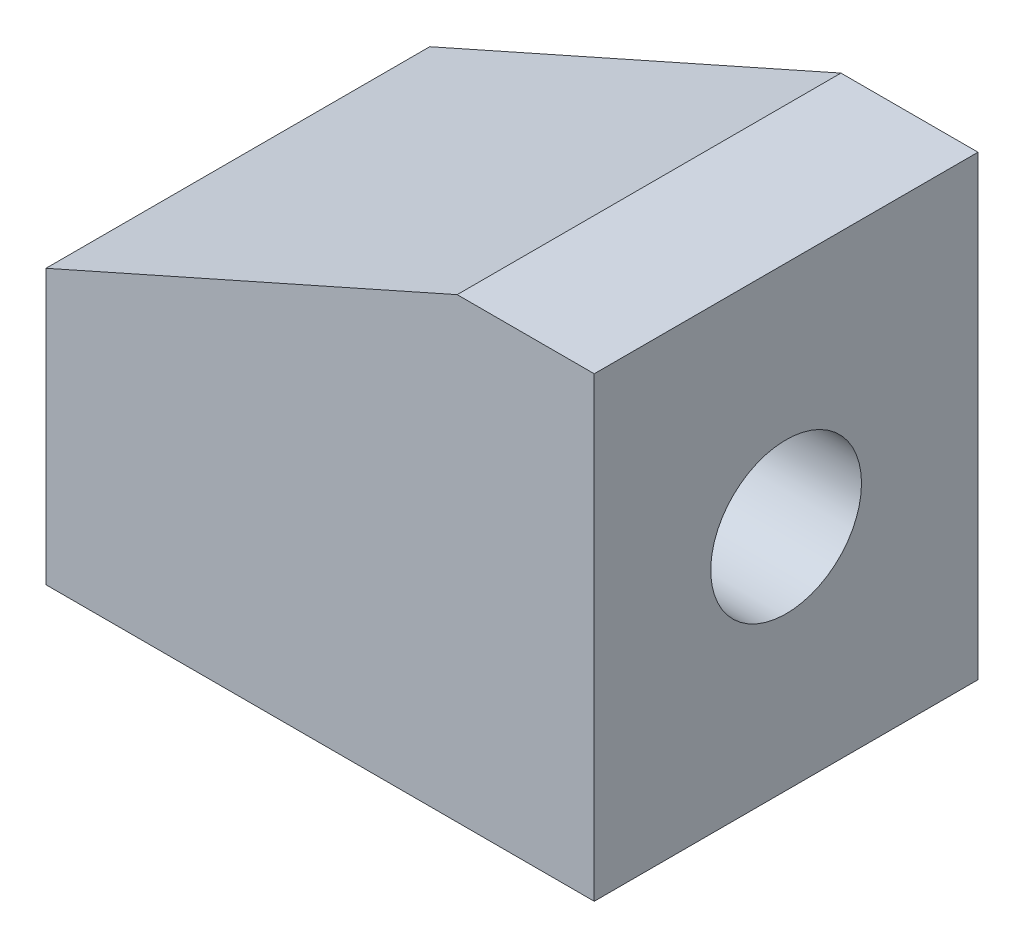
ISO-10303-21;
HEADER;
FILE_DESCRIPTION(('STEP AP214'),'2;1');
FILE_NAME('part.step','',(''),(''),'','','');
FILE_SCHEMA(('AUTOMOTIVE_DESIGN { 1 0 10303 214 1 1 1 1 }'));
ENDSEC;
DATA;
#1=APPLICATION_CONTEXT('core data for automotive mechanical design processes');
#2=APPLICATION_PROTOCOL_DEFINITION('international standard','automotive_design',2000,#1);
#3=PRODUCT_CONTEXT('',#1,'mechanical');
#4=PRODUCT('Part','Part','',(#3));
#5=PRODUCT_RELATED_PRODUCT_CATEGORY('part','',(#4));
#6=PRODUCT_DEFINITION_FORMATION('','',#4);
#7=PRODUCT_DEFINITION_CONTEXT('part definition',#1,'design');
#8=PRODUCT_DEFINITION('design','',#6,#7);
#9=PRODUCT_DEFINITION_SHAPE('','',#8);
#10=(LENGTH_UNIT() NAMED_UNIT(*) SI_UNIT(.MILLI.,.METRE.));
#11=(NAMED_UNIT(*) PLANE_ANGLE_UNIT() SI_UNIT($,.RADIAN.));
#12=(NAMED_UNIT(*) SI_UNIT($,.STERADIAN.) SOLID_ANGLE_UNIT());
#13=UNCERTAINTY_MEASURE_WITH_UNIT(LENGTH_MEASURE(1.E-05),#10,'distance_accuracy_value','');
#14=(GEOMETRIC_REPRESENTATION_CONTEXT(3) GLOBAL_UNCERTAINTY_ASSIGNED_CONTEXT((#13)) GLOBAL_UNIT_ASSIGNED_CONTEXT((#10,
#11,#12)) REPRESENTATION_CONTEXT('',''));
#15=CARTESIAN_POINT('',(0.,0.,0.));
#16=DIRECTION('',(0.,0.,1.));
#17=DIRECTION('',(1.,0.,0.));
#18=AXIS2_PLACEMENT_3D('',#15,#16,#17);
#19=CARTESIAN_POINT('',(-60.,30.,42.));
#20=DIRECTION('',(1.,0.,0.));
#21=DIRECTION('',(0.,0.,-1.));
#22=AXIS2_PLACEMENT_3D('',#19,#20,#21);
#23=PLANE('',#22);
#24=DIRECTION('',(0.,-1.,0.));
#25=VECTOR('',#24,1.);
#26=CARTESIAN_POINT('',(-60.,30.,0.));
#27=LINE('',#26,#25);
#28=CARTESIAN_POINT('',(-60.,30.,0.));
#29=VERTEX_POINT('',#28);
#30=CARTESIAN_POINT('',(-60.,0.,0.));
#31=VERTEX_POINT('',#30);
#32=EDGE_CURVE('E126',#29,#31,#27,.T.);
#33=ORIENTED_EDGE('',*,*,#32,.T.);
#34=DIRECTION('',(0.,0.,-1.));
#35=VECTOR('',#34,1.);
#36=CARTESIAN_POINT('',(-60.,0.,42.));
#37=LINE('',#36,#35);
#38=CARTESIAN_POINT('',(-60.,0.,42.));
#39=VERTEX_POINT('',#38);
#40=EDGE_CURVE('E11',#39,#31,#37,.T.);
#41=ORIENTED_EDGE('',*,*,#40,.F.);
#42=DIRECTION('',(0.,-1.,0.));
#43=VECTOR('',#42,1.);
#44=CARTESIAN_POINT('',(-60.,30.,42.));
#45=LINE('',#44,#43);
#46=CARTESIAN_POINT('',(-60.,30.,42.));
#47=VERTEX_POINT('',#46);
#48=EDGE_CURVE('E140',#47,#39,#45,.T.);
#49=ORIENTED_EDGE('',*,*,#48,.F.);
#50=DIRECTION('',(0.,0.,-1.));
#51=VECTOR('',#50,1.);
#52=CARTESIAN_POINT('',(-60.,30.,42.));
#53=LINE('',#52,#51);
#54=EDGE_CURVE('E122',#47,#29,#53,.T.);
#55=ORIENTED_EDGE('',*,*,#54,.T.);
#56=EDGE_LOOP('',(#33,#41,#49,#55));
#57=FACE_BOUND('',#56,.T.);
#58=ADVANCED_FACE('F45',(#57),#23,.F.);
#59=CARTESIAN_POINT('',(-60.,0.,42.));
#60=DIRECTION('',(0.,1.,0.));
#61=DIRECTION('',(0.,0.,1.));
#62=AXIS2_PLACEMENT_3D('',#59,#60,#61);
#63=PLANE('',#62);
#64=DIRECTION('',(1.,0.,0.));
#65=VECTOR('',#64,1.);
#66=CARTESIAN_POINT('',(-60.,0.,0.));
#67=LINE('',#66,#65);
#68=CARTESIAN_POINT('',(0.,0.,0.));
#69=VERTEX_POINT('',#68);
#70=EDGE_CURVE('E130',#31,#69,#67,.T.);
#71=ORIENTED_EDGE('',*,*,#70,.T.);
#72=DIRECTION('',(0.,0.,-1.));
#73=VECTOR('',#72,1.);
#74=CARTESIAN_POINT('',(0.,0.,42.));
#75=LINE('',#74,#73);
#76=CARTESIAN_POINT('',(0.,0.,42.));
#77=VERTEX_POINT('',#76);
#78=EDGE_CURVE('E54',#77,#69,#75,.T.);
#79=ORIENTED_EDGE('',*,*,#78,.F.);
#80=DIRECTION('',(1.,0.,0.));
#81=VECTOR('',#80,1.);
#82=CARTESIAN_POINT('',(-60.,0.,42.));
#83=LINE('',#82,#81);
#84=EDGE_CURVE('E97',#39,#77,#83,.T.);
#85=ORIENTED_EDGE('',*,*,#84,.F.);
#86=ORIENTED_EDGE('',*,*,#40,.T.);
#87=EDGE_LOOP('',(#71,#79,#85,#86));
#88=FACE_BOUND('',#87,.T.);
#89=ADVANCED_FACE('F162',(#88),#63,.F.);
#90=CARTESIAN_POINT('',(0.,0.,42.));
#91=DIRECTION('',(-1.,0.,0.));
#92=DIRECTION('',(0.,0.,1.));
#93=AXIS2_PLACEMENT_3D('',#90,#91,#92);
#94=PLANE('',#93);
#95=CARTESIAN_POINT('',(0.,25.,21.));
#96=DIRECTION('',(1.,0.,0.));
#97=DIRECTION('',(0.,0.,-1.));
#98=AXIS2_PLACEMENT_3D('',#95,#96,#97);
#99=CIRCLE('',#98,8.24999999999999);
#100=CARTESIAN_POINT('',(0.,25.,12.75));
#101=VERTEX_POINT('',#100);
#102=EDGE_CURVE('E175',#101,#101,#99,.T.);
#103=ORIENTED_EDGE('',*,*,#102,.F.);
#104=EDGE_LOOP('',(#103));
#105=FACE_BOUND('',#104,.T.);
#106=DIRECTION('',(0.,1.,0.));
#107=VECTOR('',#106,1.);
#108=CARTESIAN_POINT('',(0.,0.,0.));
#109=LINE('',#108,#107);
#110=CARTESIAN_POINT('',(0.,50.,0.));
#111=VERTEX_POINT('',#110);
#112=EDGE_CURVE('E114',#69,#111,#109,.T.);
#113=ORIENTED_EDGE('',*,*,#112,.T.);
#114=DIRECTION('',(0.,0.,-1.));
#115=VECTOR('',#114,1.);
#116=CARTESIAN_POINT('',(0.,50.,42.));
#117=LINE('',#116,#115);
#118=CARTESIAN_POINT('',(0.,50.,42.));
#119=VERTEX_POINT('',#118);
#120=EDGE_CURVE('E111',#119,#111,#117,.T.);
#121=ORIENTED_EDGE('',*,*,#120,.F.);
#122=DIRECTION('',(0.,1.,0.));
#123=VECTOR('',#122,1.);
#124=CARTESIAN_POINT('',(0.,0.,42.));
#125=LINE('',#124,#123);
#126=EDGE_CURVE('E102',#77,#119,#125,.T.);
#127=ORIENTED_EDGE('',*,*,#126,.F.);
#128=ORIENTED_EDGE('',*,*,#78,.T.);
#129=EDGE_LOOP('',(#113,#121,#127,#128));
#130=FACE_BOUND('',#129,.T.);
#131=ADVANCED_FACE('F112',(#105,#130),#94,.F.);
#132=CARTESIAN_POINT('',(0.,50.,42.));
#133=DIRECTION('',(0.,-1.,0.));
#134=DIRECTION('',(1.,0.,0.));
#135=AXIS2_PLACEMENT_3D('',#132,#133,#134);
#136=PLANE('',#135);
#137=DIRECTION('',(-1.,0.,0.));
#138=VECTOR('',#137,1.);
#139=CARTESIAN_POINT('',(0.,50.,0.));
#140=LINE('',#139,#138);
#141=CARTESIAN_POINT('',(-15.,50.,0.));
#142=VERTEX_POINT('',#141);
#143=EDGE_CURVE('E83',#111,#142,#140,.T.);
#144=ORIENTED_EDGE('',*,*,#143,.T.);
#145=DIRECTION('',(0.,0.,-1.));
#146=VECTOR('',#145,1.);
#147=CARTESIAN_POINT('',(-15.,50.,42.));
#148=LINE('',#147,#146);
#149=CARTESIAN_POINT('',(-15.,50.,42.));
#150=VERTEX_POINT('',#149);
#151=EDGE_CURVE('E116',#150,#142,#148,.T.);
#152=ORIENTED_EDGE('',*,*,#151,.F.);
#153=DIRECTION('',(-1.,0.,0.));
#154=VECTOR('',#153,1.);
#155=CARTESIAN_POINT('',(0.,50.,42.));
#156=LINE('',#155,#154);
#157=EDGE_CURVE('E106',#119,#150,#156,.T.);
#158=ORIENTED_EDGE('',*,*,#157,.F.);
#159=ORIENTED_EDGE('',*,*,#120,.T.);
#160=EDGE_LOOP('',(#144,#152,#158,#159));
#161=FACE_BOUND('',#160,.T.);
#162=ADVANCED_FACE('F118',(#161),#136,.F.);
#163=CARTESIAN_POINT('',(-15.,50.,42.));
#164=DIRECTION('',(0.406138466053447,-0.913811548620257,0.));
#165=DIRECTION('',(0.913811548620257,0.406138466053448,0.));
#166=AXIS2_PLACEMENT_3D('',#163,#164,#165);
#167=PLANE('',#166);
#168=DIRECTION('',(-0.913811548620257,-0.406138466053448,0.));
#169=VECTOR('',#168,1.);
#170=CARTESIAN_POINT('',(-15.,50.,0.));
#171=LINE('',#170,#169);
#172=EDGE_CURVE('E89',#142,#29,#171,.T.);
#173=ORIENTED_EDGE('',*,*,#172,.T.);
#174=ORIENTED_EDGE('',*,*,#54,.F.);
#175=DIRECTION('',(-0.913811548620257,-0.406138466053448,0.));
#176=VECTOR('',#175,1.);
#177=CARTESIAN_POINT('',(-15.,50.,42.));
#178=LINE('',#177,#176);
#179=EDGE_CURVE('E62',#150,#47,#178,.T.);
#180=ORIENTED_EDGE('',*,*,#179,.F.);
#181=ORIENTED_EDGE('',*,*,#151,.T.);
#182=EDGE_LOOP('',(#173,#174,#180,#181));
#183=FACE_BOUND('',#182,.T.);
#184=ADVANCED_FACE('F151',(#183),#167,.F.);
#185=CARTESIAN_POINT('',(0.,0.,42.));
#186=DIRECTION('',(0.,0.,1.));
#187=DIRECTION('',(1.,0.,0.));
#188=AXIS2_PLACEMENT_3D('',#185,#186,#187);
#189=PLANE('',#188);
#190=ORIENTED_EDGE('',*,*,#48,.T.);
#191=ORIENTED_EDGE('',*,*,#84,.T.);
#192=ORIENTED_EDGE('',*,*,#126,.T.);
#193=ORIENTED_EDGE('',*,*,#157,.T.);
#194=ORIENTED_EDGE('',*,*,#179,.T.);
#195=EDGE_LOOP('',(#190,#191,#192,#193,#194));
#196=FACE_BOUND('',#195,.T.);
#197=ADVANCED_FACE('F104',(#196),#189,.T.);
#198=CARTESIAN_POINT('',(0.,0.,0.));
#199=DIRECTION('',(0.,0.,1.));
#200=DIRECTION('',(1.,0.,0.));
#201=AXIS2_PLACEMENT_3D('',#198,#199,#200);
#202=PLANE('',#201);
#203=ORIENTED_EDGE('',*,*,#32,.F.);
#204=ORIENTED_EDGE('',*,*,#172,.F.);
#205=ORIENTED_EDGE('',*,*,#143,.F.);
#206=ORIENTED_EDGE('',*,*,#112,.F.);
#207=ORIENTED_EDGE('',*,*,#70,.F.);
#208=EDGE_LOOP('',(#203,#204,#205,#206,#207));
#209=FACE_BOUND('',#208,.T.);
#210=ADVANCED_FACE('F147',(#209),#202,.F.);
#211=CARTESIAN_POINT('',(-43.5,25.,21.));
#212=DIRECTION('',(1.,0.,0.));
#213=DIRECTION('',(0.,0.,-1.));
#214=AXIS2_PLACEMENT_3D('',#211,#212,#213);
#215=CONICAL_SURFACE('',#214,8.24999999999999,1.02974425867665);
#216=CARTESIAN_POINT('',(-48.4571001069774,25.,21.));
#217=VERTEX_POINT('',#216);
#218=VERTEX_LOOP('',#217);
#219=FACE_BOUND('',#218,.T.);
#220=CARTESIAN_POINT('',(-43.5,25.,21.));
#221=DIRECTION('',(1.,0.,0.));
#222=DIRECTION('',(0.,0.,-1.));
#223=AXIS2_PLACEMENT_3D('',#220,#221,#222);
#224=CIRCLE('',#223,8.24999999999999);
#225=CARTESIAN_POINT('',(-43.5,25.,12.75));
#226=VERTEX_POINT('',#225);
#227=EDGE_CURVE('E131',#226,#226,#224,.T.);
#228=ORIENTED_EDGE('',*,*,#227,.T.);
#229=EDGE_LOOP('',(#228));
#230=FACE_BOUND('',#229,.T.);
#231=ADVANCED_FACE('F187',(#219,#230),#215,.F.);
#232=CARTESIAN_POINT('',(0.,25.,21.));
#233=DIRECTION('',(1.,0.,0.));
#234=DIRECTION('',(0.,0.,-1.));
#235=AXIS2_PLACEMENT_3D('',#232,#233,#234);
#236=CYLINDRICAL_SURFACE('',#235,8.24999999999999);
#237=ORIENTED_EDGE('',*,*,#227,.F.);
#238=EDGE_LOOP('',(#237));
#239=FACE_BOUND('',#238,.T.);
#240=ORIENTED_EDGE('',*,*,#102,.T.);
#241=EDGE_LOOP('',(#240));
#242=FACE_BOUND('',#241,.T.);
#243=ADVANCED_FACE('F189',(#239,#242),#236,.F.);
#244=CLOSED_SHELL('',(#58,#89,#131,#162,#184,#197,#210,#231,#243));
#245=MANIFOLD_SOLID_BREP('B2',#244);
#246=ADVANCED_BREP_SHAPE_REPRESENTATION('',(#18,#245),#14);
#247=SHAPE_DEFINITION_REPRESENTATION(#9,#246);
ENDSEC;
END-ISO-10303-21;
